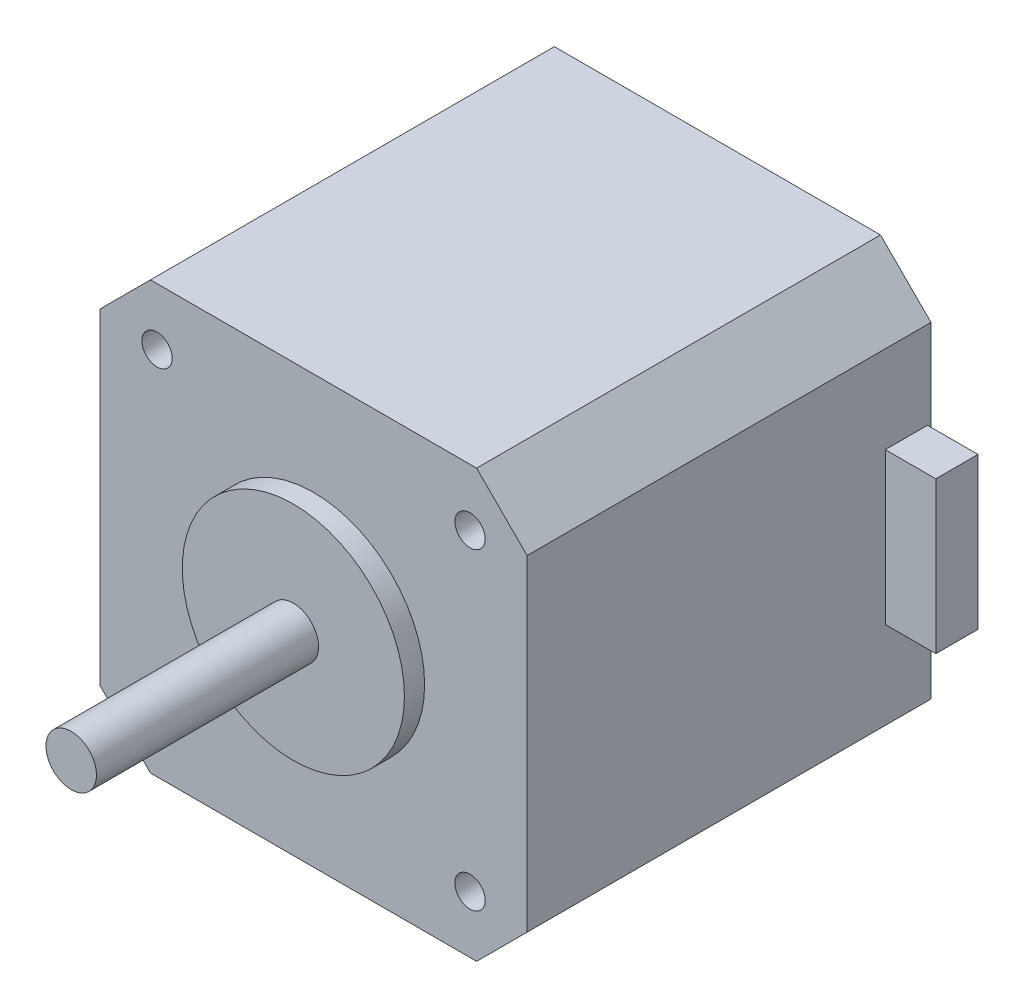
ISO-10303-21;
HEADER;
FILE_DESCRIPTION(('STEP AP214'),'2;1');
FILE_NAME('part.step','',(''),(''),'','','');
FILE_SCHEMA(('AUTOMOTIVE_DESIGN { 1 0 10303 214 1 1 1 1 }'));
ENDSEC;
DATA;
#1=APPLICATION_CONTEXT('core data for automotive mechanical design processes');
#2=APPLICATION_PROTOCOL_DEFINITION('international standard','automotive_design',2000,#1);
#3=PRODUCT_CONTEXT('',#1,'mechanical');
#4=PRODUCT('Part','Part','',(#3));
#5=PRODUCT_RELATED_PRODUCT_CATEGORY('part','',(#4));
#6=PRODUCT_DEFINITION_FORMATION('','',#4);
#7=PRODUCT_DEFINITION_CONTEXT('part definition',#1,'design');
#8=PRODUCT_DEFINITION('design','',#6,#7);
#9=PRODUCT_DEFINITION_SHAPE('','',#8);
#10=(LENGTH_UNIT() NAMED_UNIT(*) SI_UNIT(.MILLI.,.METRE.));
#11=(NAMED_UNIT(*) PLANE_ANGLE_UNIT() SI_UNIT($,.RADIAN.));
#12=(NAMED_UNIT(*) SI_UNIT($,.STERADIAN.) SOLID_ANGLE_UNIT());
#13=UNCERTAINTY_MEASURE_WITH_UNIT(LENGTH_MEASURE(1.E-05),#10,'distance_accuracy_value','');
#14=(GEOMETRIC_REPRESENTATION_CONTEXT(3) GLOBAL_UNCERTAINTY_ASSIGNED_CONTEXT((#13)) GLOBAL_UNIT_ASSIGNED_CONTEXT((#10,
#11,#12)) REPRESENTATION_CONTEXT('',''));
#15=CARTESIAN_POINT('',(0.,0.,0.));
#16=DIRECTION('',(0.,0.,1.));
#17=DIRECTION('',(1.,0.,0.));
#18=AXIS2_PLACEMENT_3D('',#15,#16,#17);
#19=CARTESIAN_POINT('',(21.15,16.15,40.));
#20=DIRECTION('',(-1.,0.,0.));
#21=DIRECTION('',(0.,-1.,0.));
#22=AXIS2_PLACEMENT_3D('',#19,#20,#21);
#23=PLANE('',#22);
#24=DIRECTION('',(0.,1.,0.));
#25=VECTOR('',#24,1.);
#26=CARTESIAN_POINT('',(21.15,16.15,0.));
#27=LINE('',#26,#25);
#28=CARTESIAN_POINT('',(21.15,-16.15,0.));
#29=VERTEX_POINT('',#28);
#30=CARTESIAN_POINT('',(21.15,16.15,0.));
#31=VERTEX_POINT('',#30);
#32=EDGE_CURVE('E213',#29,#31,#27,.T.);
#33=ORIENTED_EDGE('',*,*,#32,.T.);
#34=DIRECTION('',(0.,0.,-1.));
#35=VECTOR('',#34,1.);
#36=CARTESIAN_POINT('',(21.15,16.15,40.));
#37=LINE('',#36,#35);
#38=CARTESIAN_POINT('',(21.15,16.15,40.));
#39=VERTEX_POINT('',#38);
#40=EDGE_CURVE('E233',#39,#31,#37,.T.);
#41=ORIENTED_EDGE('',*,*,#40,.F.);
#42=DIRECTION('',(0.,1.,0.));
#43=VECTOR('',#42,1.);
#44=CARTESIAN_POINT('',(21.15,16.15,40.));
#45=LINE('',#44,#43);
#46=CARTESIAN_POINT('',(21.15,-16.15,40.));
#47=VERTEX_POINT('',#46);
#48=EDGE_CURVE('E196',#47,#39,#45,.T.);
#49=ORIENTED_EDGE('',*,*,#48,.F.);
#50=DIRECTION('',(0.,0.,-1.));
#51=VECTOR('',#50,1.);
#52=CARTESIAN_POINT('',(21.15,-16.15,40.));
#53=LINE('',#52,#51);
#54=EDGE_CURVE('E236',#47,#29,#53,.T.);
#55=ORIENTED_EDGE('',*,*,#54,.T.);
#56=EDGE_LOOP('',(#33,#41,#49,#55));
#57=FACE_BOUND('',#56,.T.);
#58=DIRECTION('',(0.,-1.,0.));
#59=VECTOR('',#58,1.);
#60=CARTESIAN_POINT('',(21.15,-7.5,4.52630715129981));
#61=LINE('',#60,#59);
#62=CARTESIAN_POINT('',(21.15,7.5,4.52630715129981));
#63=VERTEX_POINT('',#62);
#64=CARTESIAN_POINT('',(21.15,-7.5,4.52630715129981));
#65=VERTEX_POINT('',#64);
#66=EDGE_CURVE('E145',#63,#65,#61,.T.);
#67=ORIENTED_EDGE('',*,*,#66,.F.);
#68=DIRECTION('',(0.,0.,1.));
#69=VECTOR('',#68,1.);
#70=CARTESIAN_POINT('',(21.15,7.5,4.52630715129981));
#71=LINE('',#70,#69);
#72=CARTESIAN_POINT('',(21.15,7.5,0.346741981318656));
#73=VERTEX_POINT('',#72);
#74=EDGE_CURVE('E142',#73,#63,#71,.T.);
#75=ORIENTED_EDGE('',*,*,#74,.F.);
#76=DIRECTION('',(0.,1.,0.));
#77=VECTOR('',#76,1.);
#78=CARTESIAN_POINT('',(21.15,-7.5,0.346741981318655));
#79=LINE('',#78,#77);
#80=CARTESIAN_POINT('',(21.15,-7.5,0.346741981318656));
#81=VERTEX_POINT('',#80);
#82=EDGE_CURVE('E56',#81,#73,#79,.T.);
#83=ORIENTED_EDGE('',*,*,#82,.F.);
#84=DIRECTION('',(0.,0.,-1.));
#85=VECTOR('',#84,1.);
#86=CARTESIAN_POINT('',(21.15,-7.5,4.52630715129981));
#87=LINE('',#86,#85);
#88=EDGE_CURVE('E51',#65,#81,#87,.T.);
#89=ORIENTED_EDGE('',*,*,#88,.F.);
#90=EDGE_LOOP('',(#67,#75,#83,#89));
#91=FACE_BOUND('',#90,.T.);
#92=ADVANCED_FACE('F36',(#57,#91),#23,.F.);
#93=CARTESIAN_POINT('',(-21.15,-16.15,40.));
#94=DIRECTION('',(0.707106781186548,0.707106781186548,0.));
#95=DIRECTION('',(-0.707106781186548,0.707106781186548,0.));
#96=AXIS2_PLACEMENT_3D('',#93,#94,#95);
#97=PLANE('',#96);
#98=DIRECTION('',(0.707106781186548,-0.707106781186548,0.));
#99=VECTOR('',#98,1.);
#100=CARTESIAN_POINT('',(-21.15,-16.15,0.));
#101=LINE('',#100,#99);
#102=CARTESIAN_POINT('',(-21.15,-16.15,0.));
#103=VERTEX_POINT('',#102);
#104=CARTESIAN_POINT('',(-16.15,-21.15,0.));
#105=VERTEX_POINT('',#104);
#106=EDGE_CURVE('E185',#103,#105,#101,.T.);
#107=ORIENTED_EDGE('',*,*,#106,.T.);
#108=DIRECTION('',(0.,0.,-1.));
#109=VECTOR('',#108,1.);
#110=CARTESIAN_POINT('',(-16.15,-21.15,40.));
#111=LINE('',#110,#109);
#112=CARTESIAN_POINT('',(-16.15,-21.15,40.));
#113=VERTEX_POINT('',#112);
#114=EDGE_CURVE('E11',#113,#105,#111,.T.);
#115=ORIENTED_EDGE('',*,*,#114,.F.);
#116=DIRECTION('',(0.707106781186548,-0.707106781186548,0.));
#117=VECTOR('',#116,1.);
#118=CARTESIAN_POINT('',(-21.15,-16.15,40.));
#119=LINE('',#118,#117);
#120=CARTESIAN_POINT('',(-21.15,-16.15,40.));
#121=VERTEX_POINT('',#120);
#122=EDGE_CURVE('E188',#121,#113,#119,.T.);
#123=ORIENTED_EDGE('',*,*,#122,.F.);
#124=DIRECTION('',(0.,0.,-1.));
#125=VECTOR('',#124,1.);
#126=CARTESIAN_POINT('',(-21.15,-16.15,40.));
#127=LINE('',#126,#125);
#128=EDGE_CURVE('E206',#121,#103,#127,.T.);
#129=ORIENTED_EDGE('',*,*,#128,.T.);
#130=EDGE_LOOP('',(#107,#115,#123,#129));
#131=FACE_BOUND('',#130,.T.);
#132=ADVANCED_FACE('F38',(#131),#97,.F.);
#133=CARTESIAN_POINT('',(-16.15,-21.15,40.));
#134=DIRECTION('',(0.,1.,0.));
#135=DIRECTION('',(0.,0.,1.));
#136=AXIS2_PLACEMENT_3D('',#133,#134,#135);
#137=PLANE('',#136);
#138=DIRECTION('',(1.,0.,0.));
#139=VECTOR('',#138,1.);
#140=CARTESIAN_POINT('',(-16.15,-21.15,0.));
#141=LINE('',#140,#139);
#142=CARTESIAN_POINT('',(16.15,-21.15,0.));
#143=VERTEX_POINT('',#142);
#144=EDGE_CURVE('E209',#105,#143,#141,.T.);
#145=ORIENTED_EDGE('',*,*,#144,.T.);
#146=DIRECTION('',(0.,0.,-1.));
#147=VECTOR('',#146,1.);
#148=CARTESIAN_POINT('',(16.15,-21.15,40.));
#149=LINE('',#148,#147);
#150=CARTESIAN_POINT('',(16.15,-21.15,40.));
#151=VERTEX_POINT('',#150);
#152=EDGE_CURVE('E44',#151,#143,#149,.T.);
#153=ORIENTED_EDGE('',*,*,#152,.F.);
#154=DIRECTION('',(1.,0.,0.));
#155=VECTOR('',#154,1.);
#156=CARTESIAN_POINT('',(-16.15,-21.15,40.));
#157=LINE('',#156,#155);
#158=EDGE_CURVE('E191',#113,#151,#157,.T.);
#159=ORIENTED_EDGE('',*,*,#158,.F.);
#160=ORIENTED_EDGE('',*,*,#114,.T.);
#161=EDGE_LOOP('',(#145,#153,#159,#160));
#162=FACE_BOUND('',#161,.T.);
#163=ADVANCED_FACE('F265',(#162),#137,.F.);
#164=CARTESIAN_POINT('',(16.15,-21.15,40.));
#165=DIRECTION('',(-0.707106781186548,0.707106781186548,0.));
#166=DIRECTION('',(-0.707106781186548,-0.707106781186548,0.));
#167=AXIS2_PLACEMENT_3D('',#164,#165,#166);
#168=PLANE('',#167);
#169=DIRECTION('',(0.707106781186548,0.707106781186548,0.));
#170=VECTOR('',#169,1.);
#171=CARTESIAN_POINT('',(16.15,-21.15,0.));
#172=LINE('',#171,#170);
#173=EDGE_CURVE('E211',#143,#29,#172,.T.);
#174=ORIENTED_EDGE('',*,*,#173,.T.);
#175=ORIENTED_EDGE('',*,*,#54,.F.);
#176=DIRECTION('',(0.707106781186548,0.707106781186548,0.));
#177=VECTOR('',#176,1.);
#178=CARTESIAN_POINT('',(16.15,-21.15,40.));
#179=LINE('',#178,#177);
#180=EDGE_CURVE('E194',#151,#47,#179,.T.);
#181=ORIENTED_EDGE('',*,*,#180,.F.);
#182=ORIENTED_EDGE('',*,*,#152,.T.);
#183=EDGE_LOOP('',(#174,#175,#181,#182));
#184=FACE_BOUND('',#183,.T.);
#185=ADVANCED_FACE('F243',(#184),#168,.F.);
#186=CARTESIAN_POINT('',(16.15,21.15,40.));
#187=DIRECTION('',(-0.707106781186547,-0.707106781186548,0.));
#188=DIRECTION('',(0.707106781186548,-0.707106781186547,0.));
#189=AXIS2_PLACEMENT_3D('',#186,#187,#188);
#190=PLANE('',#189);
#191=DIRECTION('',(-0.707106781186548,0.707106781186547,0.));
#192=VECTOR('',#191,1.);
#193=CARTESIAN_POINT('',(16.15,21.15,0.));
#194=LINE('',#193,#192);
#195=CARTESIAN_POINT('',(16.15,21.15,0.));
#196=VERTEX_POINT('',#195);
#197=EDGE_CURVE('E215',#31,#196,#194,.T.);
#198=ORIENTED_EDGE('',*,*,#197,.T.);
#199=DIRECTION('',(0.,0.,-1.));
#200=VECTOR('',#199,1.);
#201=CARTESIAN_POINT('',(16.15,21.15,40.));
#202=LINE('',#201,#200);
#203=CARTESIAN_POINT('',(16.15,21.15,40.));
#204=VERTEX_POINT('',#203);
#205=EDGE_CURVE('E230',#204,#196,#202,.T.);
#206=ORIENTED_EDGE('',*,*,#205,.F.);
#207=DIRECTION('',(-0.707106781186548,0.707106781186547,0.));
#208=VECTOR('',#207,1.);
#209=CARTESIAN_POINT('',(16.15,21.15,40.));
#210=LINE('',#209,#208);
#211=EDGE_CURVE('E198',#39,#204,#210,.T.);
#212=ORIENTED_EDGE('',*,*,#211,.F.);
#213=ORIENTED_EDGE('',*,*,#40,.T.);
#214=EDGE_LOOP('',(#198,#206,#212,#213));
#215=FACE_BOUND('',#214,.T.);
#216=ADVANCED_FACE('F257',(#215),#190,.F.);
#217=CARTESIAN_POINT('',(-16.15,21.15,40.));
#218=DIRECTION('',(0.,-1.,0.));
#219=DIRECTION('',(0.,0.,-1.));
#220=AXIS2_PLACEMENT_3D('',#217,#218,#219);
#221=PLANE('',#220);
#222=DIRECTION('',(-1.,0.,0.));
#223=VECTOR('',#222,1.);
#224=CARTESIAN_POINT('',(-16.15,21.15,0.));
#225=LINE('',#224,#223);
#226=CARTESIAN_POINT('',(-16.15,21.15,0.));
#227=VERTEX_POINT('',#226);
#228=EDGE_CURVE('E217',#196,#227,#225,.T.);
#229=ORIENTED_EDGE('',*,*,#228,.T.);
#230=DIRECTION('',(0.,0.,-1.));
#231=VECTOR('',#230,1.);
#232=CARTESIAN_POINT('',(-16.15,21.15,40.));
#233=LINE('',#232,#231);
#234=CARTESIAN_POINT('',(-16.15,21.15,40.));
#235=VERTEX_POINT('',#234);
#236=EDGE_CURVE('E227',#235,#227,#233,.T.);
#237=ORIENTED_EDGE('',*,*,#236,.F.);
#238=DIRECTION('',(-1.,0.,0.));
#239=VECTOR('',#238,1.);
#240=CARTESIAN_POINT('',(-16.15,21.15,40.));
#241=LINE('',#240,#239);
#242=EDGE_CURVE('E200',#204,#235,#241,.T.);
#243=ORIENTED_EDGE('',*,*,#242,.F.);
#244=ORIENTED_EDGE('',*,*,#205,.T.);
#245=EDGE_LOOP('',(#229,#237,#243,#244));
#246=FACE_BOUND('',#245,.T.);
#247=ADVANCED_FACE('F278',(#246),#221,.F.);
#248=CARTESIAN_POINT('',(-21.15,16.15,40.));
#249=DIRECTION('',(0.707106781186548,-0.707106781186548,0.));
#250=DIRECTION('',(0.707106781186548,0.707106781186548,0.));
#251=AXIS2_PLACEMENT_3D('',#248,#249,#250);
#252=PLANE('',#251);
#253=DIRECTION('',(-0.707106781186547,-0.707106781186547,0.));
#254=VECTOR('',#253,1.);
#255=CARTESIAN_POINT('',(-21.15,16.15,0.));
#256=LINE('',#255,#254);
#257=CARTESIAN_POINT('',(-21.15,16.15,0.));
#258=VERTEX_POINT('',#257);
#259=EDGE_CURVE('E219',#227,#258,#256,.T.);
#260=ORIENTED_EDGE('',*,*,#259,.T.);
#261=DIRECTION('',(0.,0.,-1.));
#262=VECTOR('',#261,1.);
#263=CARTESIAN_POINT('',(-21.15,16.15,40.));
#264=LINE('',#263,#262);
#265=CARTESIAN_POINT('',(-21.15,16.15,40.));
#266=VERTEX_POINT('',#265);
#267=EDGE_CURVE('E224',#266,#258,#264,.T.);
#268=ORIENTED_EDGE('',*,*,#267,.F.);
#269=DIRECTION('',(-0.707106781186547,-0.707106781186547,0.));
#270=VECTOR('',#269,1.);
#271=CARTESIAN_POINT('',(-21.15,16.15,40.));
#272=LINE('',#271,#270);
#273=EDGE_CURVE('E202',#235,#266,#272,.T.);
#274=ORIENTED_EDGE('',*,*,#273,.F.);
#275=ORIENTED_EDGE('',*,*,#236,.T.);
#276=EDGE_LOOP('',(#260,#268,#274,#275));
#277=FACE_BOUND('',#276,.T.);
#278=ADVANCED_FACE('F276',(#277),#252,.F.);
#279=CARTESIAN_POINT('',(-21.15,16.15,40.));
#280=DIRECTION('',(1.,0.,0.));
#281=DIRECTION('',(0.,0.,-1.));
#282=AXIS2_PLACEMENT_3D('',#279,#280,#281);
#283=PLANE('',#282);
#284=DIRECTION('',(0.,-1.,0.));
#285=VECTOR('',#284,1.);
#286=CARTESIAN_POINT('',(-21.15,16.15,0.));
#287=LINE('',#286,#285);
#288=EDGE_CURVE('E192',#258,#103,#287,.T.);
#289=ORIENTED_EDGE('',*,*,#288,.T.);
#290=ORIENTED_EDGE('',*,*,#128,.F.);
#291=DIRECTION('',(0.,-1.,0.));
#292=VECTOR('',#291,1.);
#293=CARTESIAN_POINT('',(-21.15,16.15,40.));
#294=LINE('',#293,#292);
#295=EDGE_CURVE('E204',#266,#121,#294,.T.);
#296=ORIENTED_EDGE('',*,*,#295,.F.);
#297=ORIENTED_EDGE('',*,*,#267,.T.);
#298=EDGE_LOOP('',(#289,#290,#296,#297));
#299=FACE_BOUND('',#298,.T.);
#300=ADVANCED_FACE('F271',(#299),#283,.F.);
#301=CARTESIAN_POINT('',(0.,0.,40.));
#302=DIRECTION('',(0.,0.,1.));
#303=DIRECTION('',(1.,0.,0.));
#304=AXIS2_PLACEMENT_3D('',#301,#302,#303);
#305=PLANE('',#304);
#306=CARTESIAN_POINT('',(15.5,15.5,40.));
#307=DIRECTION('',(0.,0.,1.));
#308=DIRECTION('',(1.,0.,0.));
#309=AXIS2_PLACEMENT_3D('',#306,#307,#308);
#310=CIRCLE('',#309,1.5);
#311=CARTESIAN_POINT('',(17.,15.5,40.));
#312=VERTEX_POINT('',#311);
#313=EDGE_CURVE('E159',#312,#312,#310,.T.);
#314=ORIENTED_EDGE('',*,*,#313,.F.);
#315=EDGE_LOOP('',(#314));
#316=FACE_BOUND('',#315,.T.);
#317=CARTESIAN_POINT('',(-15.5,-15.5,40.));
#318=DIRECTION('',(0.,0.,1.));
#319=DIRECTION('',(1.,0.,0.));
#320=AXIS2_PLACEMENT_3D('',#317,#318,#319);
#321=CIRCLE('',#320,1.5);
#322=CARTESIAN_POINT('',(-14.,-15.5,40.));
#323=VERTEX_POINT('',#322);
#324=EDGE_CURVE('E165',#323,#323,#321,.T.);
#325=ORIENTED_EDGE('',*,*,#324,.F.);
#326=EDGE_LOOP('',(#325));
#327=FACE_BOUND('',#326,.T.);
#328=CARTESIAN_POINT('',(-15.5,15.5,40.));
#329=DIRECTION('',(0.,0.,1.));
#330=DIRECTION('',(1.,0.,0.));
#331=AXIS2_PLACEMENT_3D('',#328,#329,#330);
#332=CIRCLE('',#331,1.5);
#333=CARTESIAN_POINT('',(-14.,15.5,40.));
#334=VERTEX_POINT('',#333);
#335=EDGE_CURVE('E146',#334,#334,#332,.T.);
#336=ORIENTED_EDGE('',*,*,#335,.F.);
#337=EDGE_LOOP('',(#336));
#338=FACE_BOUND('',#337,.T.);
#339=CARTESIAN_POINT('',(15.5,-15.5,40.));
#340=DIRECTION('',(0.,0.,1.));
#341=DIRECTION('',(1.,0.,0.));
#342=AXIS2_PLACEMENT_3D('',#339,#340,#341);
#343=CIRCLE('',#342,1.5);
#344=CARTESIAN_POINT('',(17.,-15.5,40.));
#345=VERTEX_POINT('',#344);
#346=EDGE_CURVE('E158',#345,#345,#343,.T.);
#347=ORIENTED_EDGE('',*,*,#346,.F.);
#348=EDGE_LOOP('',(#347));
#349=FACE_BOUND('',#348,.T.);
#350=CARTESIAN_POINT('',(0.,0.,40.));
#351=DIRECTION('',(0.,0.,1.));
#352=DIRECTION('',(1.,0.,0.));
#353=AXIS2_PLACEMENT_3D('',#350,#351,#352);
#354=CIRCLE('',#353,11.);
#355=CARTESIAN_POINT('',(11.,0.,40.));
#356=VERTEX_POINT('',#355);
#357=EDGE_CURVE('E179',#356,#356,#354,.T.);
#358=ORIENTED_EDGE('',*,*,#357,.F.);
#359=EDGE_LOOP('',(#358));
#360=FACE_BOUND('',#359,.T.);
#361=ORIENTED_EDGE('',*,*,#122,.T.);
#362=ORIENTED_EDGE('',*,*,#158,.T.);
#363=ORIENTED_EDGE('',*,*,#180,.T.);
#364=ORIENTED_EDGE('',*,*,#48,.T.);
#365=ORIENTED_EDGE('',*,*,#211,.T.);
#366=ORIENTED_EDGE('',*,*,#242,.T.);
#367=ORIENTED_EDGE('',*,*,#273,.T.);
#368=ORIENTED_EDGE('',*,*,#295,.T.);
#369=EDGE_LOOP('',(#361,#362,#363,#364,#365,#366,#367,#368));
#370=FACE_BOUND('',#369,.T.);
#371=ADVANCED_FACE('F261',(#316,#327,#338,#349,#360,#370),#305,.T.);
#372=CARTESIAN_POINT('',(0.,0.,0.));
#373=DIRECTION('',(0.,0.,1.));
#374=DIRECTION('',(1.,0.,0.));
#375=AXIS2_PLACEMENT_3D('',#372,#373,#374);
#376=PLANE('',#375);
#377=ORIENTED_EDGE('',*,*,#106,.F.);
#378=ORIENTED_EDGE('',*,*,#288,.F.);
#379=ORIENTED_EDGE('',*,*,#259,.F.);
#380=ORIENTED_EDGE('',*,*,#228,.F.);
#381=ORIENTED_EDGE('',*,*,#197,.F.);
#382=ORIENTED_EDGE('',*,*,#32,.F.);
#383=ORIENTED_EDGE('',*,*,#173,.F.);
#384=ORIENTED_EDGE('',*,*,#144,.F.);
#385=EDGE_LOOP('',(#377,#378,#379,#380,#381,#382,#383,#384));
#386=FACE_BOUND('',#385,.T.);
#387=ADVANCED_FACE('F249',(#386),#376,.F.);
#388=CARTESIAN_POINT('',(0.,0.,42.));
#389=DIRECTION('',(0.,0.,-1.));
#390=DIRECTION('',(-1.,0.,0.));
#391=AXIS2_PLACEMENT_3D('',#388,#389,#390);
#392=CYLINDRICAL_SURFACE('',#391,11.);
#393=CARTESIAN_POINT('',(0.,0.,42.));
#394=DIRECTION('',(0.,0.,1.));
#395=DIRECTION('',(1.,0.,0.));
#396=AXIS2_PLACEMENT_3D('',#393,#394,#395);
#397=CIRCLE('',#396,11.);
#398=CARTESIAN_POINT('',(11.,0.,42.));
#399=VERTEX_POINT('',#398);
#400=EDGE_CURVE('E182',#399,#399,#397,.T.);
#401=ORIENTED_EDGE('',*,*,#400,.F.);
#402=EDGE_LOOP('',(#401));
#403=FACE_BOUND('',#402,.T.);
#404=ORIENTED_EDGE('',*,*,#357,.T.);
#405=EDGE_LOOP('',(#404));
#406=FACE_BOUND('',#405,.T.);
#407=ADVANCED_FACE('F369',(#403,#406),#392,.T.);
#408=CARTESIAN_POINT('',(0.,0.,42.));
#409=DIRECTION('',(0.,0.,1.));
#410=DIRECTION('',(1.,0.,0.));
#411=AXIS2_PLACEMENT_3D('',#408,#409,#410);
#412=PLANE('',#411);
#413=CARTESIAN_POINT('',(0.,0.,42.));
#414=DIRECTION('',(0.,0.,1.));
#415=DIRECTION('',(1.,0.,0.));
#416=AXIS2_PLACEMENT_3D('',#413,#414,#415);
#417=CIRCLE('',#416,2.5);
#418=CARTESIAN_POINT('',(2.5,0.,42.));
#419=VERTEX_POINT('',#418);
#420=EDGE_CURVE('E173',#419,#419,#417,.T.);
#421=ORIENTED_EDGE('',*,*,#420,.F.);
#422=EDGE_LOOP('',(#421));
#423=FACE_BOUND('',#422,.T.);
#424=ORIENTED_EDGE('',*,*,#400,.T.);
#425=EDGE_LOOP('',(#424));
#426=FACE_BOUND('',#425,.T.);
#427=ADVANCED_FACE('F377',(#423,#426),#412,.T.);
#428=CARTESIAN_POINT('',(0.,0.,64.));
#429=DIRECTION('',(0.,0.,-1.));
#430=DIRECTION('',(-1.,0.,0.));
#431=AXIS2_PLACEMENT_3D('',#428,#429,#430);
#432=CYLINDRICAL_SURFACE('',#431,2.5);
#433=CARTESIAN_POINT('',(0.,0.,64.));
#434=DIRECTION('',(0.,0.,1.));
#435=DIRECTION('',(1.,0.,0.));
#436=AXIS2_PLACEMENT_3D('',#433,#434,#435);
#437=CIRCLE('',#436,2.5);
#438=CARTESIAN_POINT('',(2.5,0.,64.));
#439=VERTEX_POINT('',#438);
#440=EDGE_CURVE('E176',#439,#439,#437,.T.);
#441=ORIENTED_EDGE('',*,*,#440,.F.);
#442=EDGE_LOOP('',(#441));
#443=FACE_BOUND('',#442,.T.);
#444=ORIENTED_EDGE('',*,*,#420,.T.);
#445=EDGE_LOOP('',(#444));
#446=FACE_BOUND('',#445,.T.);
#447=ADVANCED_FACE('F386',(#443,#446),#432,.T.);
#448=CARTESIAN_POINT('',(0.,0.,64.));
#449=DIRECTION('',(0.,0.,1.));
#450=DIRECTION('',(1.,0.,0.));
#451=AXIS2_PLACEMENT_3D('',#448,#449,#450);
#452=PLANE('',#451);
#453=ORIENTED_EDGE('',*,*,#440,.T.);
#454=EDGE_LOOP('',(#453));
#455=FACE_BOUND('',#454,.T.);
#456=ADVANCED_FACE('F395',(#455),#452,.T.);
#457=CARTESIAN_POINT('',(15.5,-15.5,25.));
#458=DIRECTION('',(0.,0.,1.));
#459=DIRECTION('',(1.,0.,0.));
#460=AXIS2_PLACEMENT_3D('',#457,#458,#459);
#461=CYLINDRICAL_SURFACE('',#460,1.5);
#462=CARTESIAN_POINT('',(15.5,-15.5,25.));
#463=DIRECTION('',(0.,0.,1.));
#464=DIRECTION('',(1.,0.,0.));
#465=AXIS2_PLACEMENT_3D('',#462,#463,#464);
#466=CIRCLE('',#465,1.5);
#467=CARTESIAN_POINT('',(17.,-15.5,25.));
#468=VERTEX_POINT('',#467);
#469=EDGE_CURVE('E170',#468,#468,#466,.T.);
#470=ORIENTED_EDGE('',*,*,#469,.F.);
#471=EDGE_LOOP('',(#470));
#472=FACE_BOUND('',#471,.T.);
#473=ORIENTED_EDGE('',*,*,#346,.T.);
#474=EDGE_LOOP('',(#473));
#475=FACE_BOUND('',#474,.T.);
#476=ADVANCED_FACE('F403',(#472,#475),#461,.F.);
#477=CARTESIAN_POINT('',(15.5,-15.5,25.));
#478=DIRECTION('',(0.,0.,1.));
#479=DIRECTION('',(1.,0.,0.));
#480=AXIS2_PLACEMENT_3D('',#477,#478,#479);
#481=PLANE('',#480);
#482=ORIENTED_EDGE('',*,*,#469,.T.);
#483=EDGE_LOOP('',(#482));
#484=FACE_BOUND('',#483,.T.);
#485=ADVANCED_FACE('F411',(#484),#481,.T.);
#486=CARTESIAN_POINT('',(-15.5,15.5,25.));
#487=DIRECTION('',(0.,0.,1.));
#488=DIRECTION('',(1.,0.,0.));
#489=AXIS2_PLACEMENT_3D('',#486,#487,#488);
#490=CYLINDRICAL_SURFACE('',#489,1.5);
#491=CARTESIAN_POINT('',(-15.5,15.5,25.));
#492=DIRECTION('',(0.,0.,1.));
#493=DIRECTION('',(1.,0.,0.));
#494=AXIS2_PLACEMENT_3D('',#491,#492,#493);
#495=CIRCLE('',#494,1.5);
#496=CARTESIAN_POINT('',(-14.,15.5,25.));
#497=VERTEX_POINT('',#496);
#498=EDGE_CURVE('E149',#497,#497,#495,.T.);
#499=ORIENTED_EDGE('',*,*,#498,.F.);
#500=EDGE_LOOP('',(#499));
#501=FACE_BOUND('',#500,.T.);
#502=ORIENTED_EDGE('',*,*,#335,.T.);
#503=EDGE_LOOP('',(#502));
#504=FACE_BOUND('',#503,.T.);
#505=ADVANCED_FACE('F420',(#501,#504),#490,.F.);
#506=CARTESIAN_POINT('',(-15.5,15.5,25.));
#507=DIRECTION('',(0.,0.,1.));
#508=DIRECTION('',(1.,0.,0.));
#509=AXIS2_PLACEMENT_3D('',#506,#507,#508);
#510=PLANE('',#509);
#511=ORIENTED_EDGE('',*,*,#498,.T.);
#512=EDGE_LOOP('',(#511));
#513=FACE_BOUND('',#512,.T.);
#514=ADVANCED_FACE('F429',(#513),#510,.T.);
#515=CARTESIAN_POINT('',(-15.5,-15.5,25.));
#516=DIRECTION('',(0.,0.,1.));
#517=DIRECTION('',(1.,0.,0.));
#518=AXIS2_PLACEMENT_3D('',#515,#516,#517);
#519=CYLINDRICAL_SURFACE('',#518,1.5);
#520=CARTESIAN_POINT('',(-15.5,-15.5,25.));
#521=DIRECTION('',(0.,0.,1.));
#522=DIRECTION('',(1.,0.,0.));
#523=AXIS2_PLACEMENT_3D('',#520,#521,#522);
#524=CIRCLE('',#523,1.5);
#525=CARTESIAN_POINT('',(-14.,-15.5,25.));
#526=VERTEX_POINT('',#525);
#527=EDGE_CURVE('E162',#526,#526,#524,.T.);
#528=ORIENTED_EDGE('',*,*,#527,.F.);
#529=EDGE_LOOP('',(#528));
#530=FACE_BOUND('',#529,.T.);
#531=ORIENTED_EDGE('',*,*,#324,.T.);
#532=EDGE_LOOP('',(#531));
#533=FACE_BOUND('',#532,.T.);
#534=ADVANCED_FACE('F438',(#530,#533),#519,.F.);
#535=CARTESIAN_POINT('',(-15.5,-15.5,25.));
#536=DIRECTION('',(0.,0.,1.));
#537=DIRECTION('',(1.,0.,0.));
#538=AXIS2_PLACEMENT_3D('',#535,#536,#537);
#539=PLANE('',#538);
#540=ORIENTED_EDGE('',*,*,#527,.T.);
#541=EDGE_LOOP('',(#540));
#542=FACE_BOUND('',#541,.T.);
#543=ADVANCED_FACE('F447',(#542),#539,.T.);
#544=CARTESIAN_POINT('',(15.5,15.5,25.));
#545=DIRECTION('',(0.,0.,1.));
#546=DIRECTION('',(1.,0.,0.));
#547=AXIS2_PLACEMENT_3D('',#544,#545,#546);
#548=CYLINDRICAL_SURFACE('',#547,1.5);
#549=CARTESIAN_POINT('',(15.5,15.5,25.));
#550=DIRECTION('',(0.,0.,1.));
#551=DIRECTION('',(1.,0.,0.));
#552=AXIS2_PLACEMENT_3D('',#549,#550,#551);
#553=CIRCLE('',#552,1.5);
#554=CARTESIAN_POINT('',(17.,15.5,25.));
#555=VERTEX_POINT('',#554);
#556=EDGE_CURVE('E155',#555,#555,#553,.T.);
#557=ORIENTED_EDGE('',*,*,#556,.F.);
#558=EDGE_LOOP('',(#557));
#559=FACE_BOUND('',#558,.T.);
#560=ORIENTED_EDGE('',*,*,#313,.T.);
#561=EDGE_LOOP('',(#560));
#562=FACE_BOUND('',#561,.T.);
#563=ADVANCED_FACE('F456',(#559,#562),#548,.F.);
#564=CARTESIAN_POINT('',(15.5,15.5,25.));
#565=DIRECTION('',(0.,0.,1.));
#566=DIRECTION('',(1.,0.,0.));
#567=AXIS2_PLACEMENT_3D('',#564,#565,#566);
#568=PLANE('',#567);
#569=ORIENTED_EDGE('',*,*,#556,.T.);
#570=EDGE_LOOP('',(#569));
#571=FACE_BOUND('',#570,.T.);
#572=ADVANCED_FACE('F465',(#571),#568,.T.);
#573=CARTESIAN_POINT('',(26.15,-7.5,4.52630715129981));
#574=DIRECTION('',(0.,0.,-1.));
#575=DIRECTION('',(-1.,0.,0.));
#576=AXIS2_PLACEMENT_3D('',#573,#574,#575);
#577=PLANE('',#576);
#578=ORIENTED_EDGE('',*,*,#66,.T.);
#579=DIRECTION('',(-1.,0.,0.));
#580=VECTOR('',#579,1.);
#581=CARTESIAN_POINT('',(26.15,-7.5,4.52630715129981));
#582=LINE('',#581,#580);
#583=CARTESIAN_POINT('',(26.15,-7.5,4.52630715129981));
#584=VERTEX_POINT('',#583);
#585=EDGE_CURVE('E126',#584,#65,#582,.T.);
#586=ORIENTED_EDGE('',*,*,#585,.F.);
#587=DIRECTION('',(0.,-1.,0.));
#588=VECTOR('',#587,1.);
#589=CARTESIAN_POINT('',(26.15,-7.5,4.52630715129981));
#590=LINE('',#589,#588);
#591=CARTESIAN_POINT('',(26.15,7.5,4.52630715129981));
#592=VERTEX_POINT('',#591);
#593=EDGE_CURVE('E133',#592,#584,#590,.T.);
#594=ORIENTED_EDGE('',*,*,#593,.F.);
#595=DIRECTION('',(-1.,0.,0.));
#596=VECTOR('',#595,1.);
#597=CARTESIAN_POINT('',(26.15,7.5,4.52630715129981));
#598=LINE('',#597,#596);
#599=EDGE_CURVE('E544',#592,#63,#598,.T.);
#600=ORIENTED_EDGE('',*,*,#599,.T.);
#601=EDGE_LOOP('',(#578,#586,#594,#600));
#602=FACE_BOUND('',#601,.T.);
#603=ADVANCED_FACE('F144',(#602),#577,.F.);
#604=CARTESIAN_POINT('',(26.15,-7.5,4.52630715129981));
#605=DIRECTION('',(0.,1.,0.));
#606=DIRECTION('',(-1.,0.,0.));
#607=AXIS2_PLACEMENT_3D('',#604,#605,#606);
#608=PLANE('',#607);
#609=ORIENTED_EDGE('',*,*,#88,.T.);
#610=DIRECTION('',(-1.,0.,0.));
#611=VECTOR('',#610,1.);
#612=CARTESIAN_POINT('',(26.15,-7.5,0.346741981318655));
#613=LINE('',#612,#611);
#614=CARTESIAN_POINT('',(26.15,-7.5,0.346741981318655));
#615=VERTEX_POINT('',#614);
#616=EDGE_CURVE('E129',#615,#81,#613,.T.);
#617=ORIENTED_EDGE('',*,*,#616,.F.);
#618=DIRECTION('',(0.,0.,-1.));
#619=VECTOR('',#618,1.);
#620=CARTESIAN_POINT('',(26.15,-7.5,4.52630715129981));
#621=LINE('',#620,#619);
#622=EDGE_CURVE('E122',#584,#615,#621,.T.);
#623=ORIENTED_EDGE('',*,*,#622,.F.);
#624=ORIENTED_EDGE('',*,*,#585,.T.);
#625=EDGE_LOOP('',(#609,#617,#623,#624));
#626=FACE_BOUND('',#625,.T.);
#627=ADVANCED_FACE('F124',(#626),#608,.F.);
#628=CARTESIAN_POINT('',(26.15,-7.5,0.346741981318655));
#629=DIRECTION('',(0.,0.,1.));
#630=DIRECTION('',(1.,0.,0.));
#631=AXIS2_PLACEMENT_3D('',#628,#629,#630);
#632=PLANE('',#631);
#633=ORIENTED_EDGE('',*,*,#82,.T.);
#634=DIRECTION('',(-1.,0.,0.));
#635=VECTOR('',#634,1.);
#636=CARTESIAN_POINT('',(26.15,7.5,0.346741981318655));
#637=LINE('',#636,#635);
#638=CARTESIAN_POINT('',(26.15,7.5,0.346741981318655));
#639=VERTEX_POINT('',#638);
#640=EDGE_CURVE('E151',#639,#73,#637,.T.);
#641=ORIENTED_EDGE('',*,*,#640,.F.);
#642=DIRECTION('',(0.,1.,0.));
#643=VECTOR('',#642,1.);
#644=CARTESIAN_POINT('',(26.15,-7.5,0.346741981318655));
#645=LINE('',#644,#643);
#646=EDGE_CURVE('E132',#615,#639,#645,.T.);
#647=ORIENTED_EDGE('',*,*,#646,.F.);
#648=ORIENTED_EDGE('',*,*,#616,.T.);
#649=EDGE_LOOP('',(#633,#641,#647,#648));
#650=FACE_BOUND('',#649,.T.);
#651=ADVANCED_FACE('F494',(#650),#632,.F.);
#652=CARTESIAN_POINT('',(26.15,7.5,4.52630715129981));
#653=DIRECTION('',(0.,-1.,0.));
#654=DIRECTION('',(1.,0.,0.));
#655=AXIS2_PLACEMENT_3D('',#652,#653,#654);
#656=PLANE('',#655);
#657=ORIENTED_EDGE('',*,*,#74,.T.);
#658=ORIENTED_EDGE('',*,*,#599,.F.);
#659=DIRECTION('',(0.,0.,1.));
#660=VECTOR('',#659,1.);
#661=CARTESIAN_POINT('',(26.15,7.5,4.52630715129981));
#662=LINE('',#661,#660);
#663=EDGE_CURVE('E138',#639,#592,#662,.T.);
#664=ORIENTED_EDGE('',*,*,#663,.F.);
#665=ORIENTED_EDGE('',*,*,#640,.T.);
#666=EDGE_LOOP('',(#657,#658,#664,#665));
#667=FACE_BOUND('',#666,.T.);
#668=ADVANCED_FACE('F502',(#667),#656,.F.);
#669=CARTESIAN_POINT('',(26.15,0.,0.));
#670=DIRECTION('',(-1.,0.,0.));
#671=DIRECTION('',(0.,0.,1.));
#672=AXIS2_PLACEMENT_3D('',#669,#670,#671);
#673=PLANE('',#672);
#674=ORIENTED_EDGE('',*,*,#593,.T.);
#675=ORIENTED_EDGE('',*,*,#622,.T.);
#676=ORIENTED_EDGE('',*,*,#646,.T.);
#677=ORIENTED_EDGE('',*,*,#663,.T.);
#678=EDGE_LOOP('',(#674,#675,#676,#677));
#679=FACE_BOUND('',#678,.T.);
#680=ADVANCED_FACE('F136',(#679),#673,.F.);
#681=CLOSED_SHELL('',(#92,#132,#163,#185,#216,#247,#278,#300,#371,#387,#407,#427,#447,#456,#476,
#485,#505,#514,#534,#543,#563,#572,#603,#627,#651,#668,#680));
#682=MANIFOLD_SOLID_BREP('B2',#681);
#683=ADVANCED_BREP_SHAPE_REPRESENTATION('',(#18,#682),#14);
#684=SHAPE_DEFINITION_REPRESENTATION(#9,#683);
ENDSEC;
END-ISO-10303-21;
